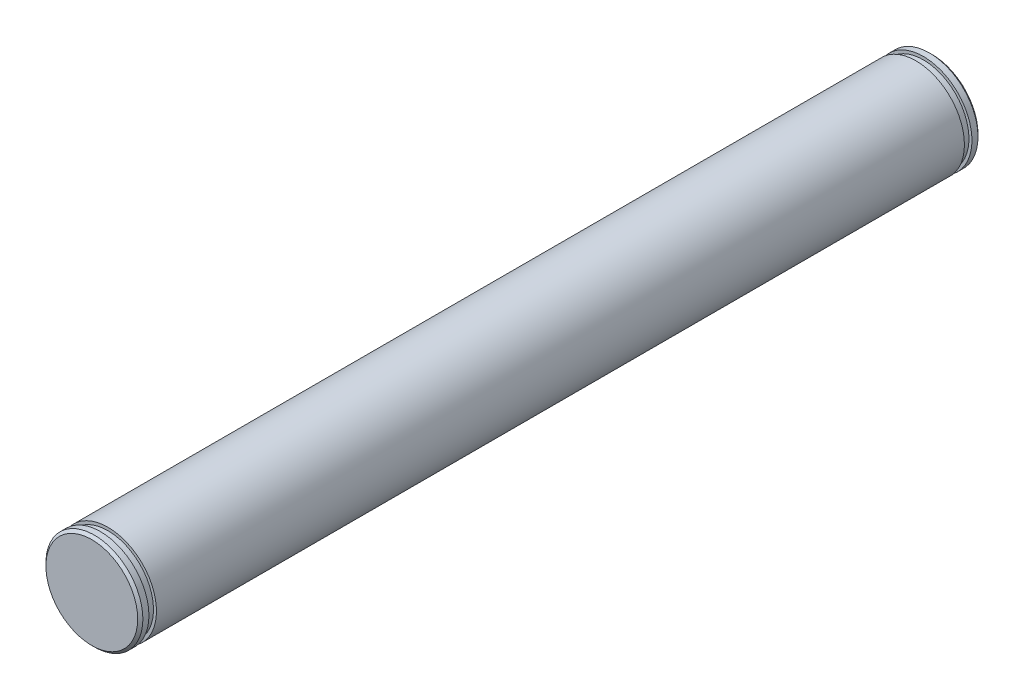
ISO-10303-21;
HEADER;
FILE_DESCRIPTION(('STEP AP214'),'2;1');
FILE_NAME('part.step','',(''),(''),'','','');
FILE_SCHEMA(('AUTOMOTIVE_DESIGN { 1 0 10303 214 1 1 1 1 }'));
ENDSEC;
DATA;
#1=APPLICATION_CONTEXT('core data for automotive mechanical design processes');
#2=APPLICATION_PROTOCOL_DEFINITION('international standard','automotive_design',2000,#1);
#3=PRODUCT_CONTEXT('',#1,'mechanical');
#4=PRODUCT('Part','Part','',(#3));
#5=PRODUCT_RELATED_PRODUCT_CATEGORY('part','',(#4));
#6=PRODUCT_DEFINITION_FORMATION('','',#4);
#7=PRODUCT_DEFINITION_CONTEXT('part definition',#1,'design');
#8=PRODUCT_DEFINITION('design','',#6,#7);
#9=PRODUCT_DEFINITION_SHAPE('','',#8);
#10=(LENGTH_UNIT() NAMED_UNIT(*) SI_UNIT(.MILLI.,.METRE.));
#11=(NAMED_UNIT(*) PLANE_ANGLE_UNIT() SI_UNIT($,.RADIAN.));
#12=(NAMED_UNIT(*) SI_UNIT($,.STERADIAN.) SOLID_ANGLE_UNIT());
#13=UNCERTAINTY_MEASURE_WITH_UNIT(LENGTH_MEASURE(1.E-05),#10,'distance_accuracy_value','');
#14=(GEOMETRIC_REPRESENTATION_CONTEXT(3) GLOBAL_UNCERTAINTY_ASSIGNED_CONTEXT((#13)) GLOBAL_UNIT_ASSIGNED_CONTEXT((#10,
#11,#12)) REPRESENTATION_CONTEXT('',''));
#15=CARTESIAN_POINT('',(0.,0.,0.));
#16=DIRECTION('',(0.,0.,1.));
#17=DIRECTION('',(1.,0.,0.));
#18=AXIS2_PLACEMENT_3D('',#15,#16,#17);
#19=CARTESIAN_POINT('',(0.,0.,41.275));
#20=DIRECTION('',(0.,0.,-1.));
#21=DIRECTION('',(-1.,0.,0.));
#22=AXIS2_PLACEMENT_3D('',#19,#20,#21);
#23=CYLINDRICAL_SURFACE('',#22,4.7625);
#24=CARTESIAN_POINT('',(0.,0.,41.021));
#25=DIRECTION('',(0.,0.,1.));
#26=DIRECTION('',(1.,0.,0.));
#27=AXIS2_PLACEMENT_3D('',#24,#25,#26);
#28=CIRCLE('',#27,4.7625);
#29=CARTESIAN_POINT('',(4.7625,0.,41.021));
#30=VERTEX_POINT('',#29);
#31=EDGE_CURVE('E10',#30,#30,#28,.F.);
#32=ORIENTED_EDGE('',*,*,#31,.T.);
#33=EDGE_LOOP('',(#32));
#34=FACE_BOUND('',#33,.T.);
#35=CARTESIAN_POINT('',(0.,0.,40.4241));
#36=DIRECTION('',(0.,0.,1.));
#37=DIRECTION('',(1.,0.,0.));
#38=AXIS2_PLACEMENT_3D('',#35,#36,#37);
#39=CIRCLE('',#38,4.7625);
#40=CARTESIAN_POINT('',(4.7625,0.,40.4241));
#41=VERTEX_POINT('',#40);
#42=EDGE_CURVE('E73',#41,#41,#39,.T.);
#43=ORIENTED_EDGE('',*,*,#42,.T.);
#44=EDGE_LOOP('',(#43));
#45=FACE_BOUND('',#44,.T.);
#46=ADVANCED_FACE('F34',(#34,#45),#23,.T.);
#47=CARTESIAN_POINT('',(0.,0.,41.275));
#48=DIRECTION('',(0.,0.,1.));
#49=DIRECTION('',(1.,0.,0.));
#50=AXIS2_PLACEMENT_3D('',#47,#48,#49);
#51=PLANE('',#50);
#52=CARTESIAN_POINT('',(0.,0.,41.275));
#53=DIRECTION('',(0.,0.,1.));
#54=DIRECTION('',(1.,0.,0.));
#55=AXIS2_PLACEMENT_3D('',#52,#53,#54);
#56=CIRCLE('',#55,4.50850000000002);
#57=CARTESIAN_POINT('',(4.50850000000002,0.,41.275));
#58=VERTEX_POINT('',#57);
#59=EDGE_CURVE('E42',#58,#58,#56,.T.);
#60=ORIENTED_EDGE('',*,*,#59,.T.);
#61=EDGE_LOOP('',(#60));
#62=FACE_BOUND('',#61,.T.);
#63=ADVANCED_FACE('F97',(#62),#51,.T.);
#64=CARTESIAN_POINT('',(0.,7.01039999999999,40.4241));
#65=DIRECTION('',(0.,0.,1.));
#66=DIRECTION('',(1.,0.,0.));
#67=AXIS2_PLACEMENT_3D('',#64,#65,#66);
#68=PLANE('',#67);
#69=CARTESIAN_POINT('',(0.,0.,40.4241));
#70=DIRECTION('',(0.,0.,-1.));
#71=DIRECTION('',(-1.,0.,0.));
#72=AXIS2_PLACEMENT_3D('',#69,#70,#71);
#73=CIRCLE('',#72,4.47039999999999);
#74=CARTESIAN_POINT('',(-4.47039999999999,0.,40.4241));
#75=VERTEX_POINT('',#74);
#76=EDGE_CURVE('E67',#75,#75,#73,.T.);
#77=ORIENTED_EDGE('',*,*,#76,.F.);
#78=EDGE_LOOP('',(#77));
#79=FACE_BOUND('',#78,.T.);
#80=ORIENTED_EDGE('',*,*,#42,.F.);
#81=EDGE_LOOP('',(#80));
#82=FACE_BOUND('',#81,.T.);
#83=ADVANCED_FACE('F113',(#79,#82),#68,.F.);
#84=CARTESIAN_POINT('',(0.,7.01039999999999,39.6875));
#85=DIRECTION('',(0.,0.,-1.));
#86=DIRECTION('',(-1.,0.,0.));
#87=AXIS2_PLACEMENT_3D('',#84,#85,#86);
#88=PLANE('',#87);
#89=CARTESIAN_POINT('',(0.,0.,39.6875));
#90=DIRECTION('',(0.,0.,-1.));
#91=DIRECTION('',(-1.,0.,0.));
#92=AXIS2_PLACEMENT_3D('',#89,#90,#91);
#93=CIRCLE('',#92,4.47039999999999);
#94=CARTESIAN_POINT('',(-4.47039999999999,0.,39.6875));
#95=VERTEX_POINT('',#94);
#96=EDGE_CURVE('E56',#95,#95,#93,.T.);
#97=ORIENTED_EDGE('',*,*,#96,.T.);
#98=EDGE_LOOP('',(#97));
#99=FACE_BOUND('',#98,.T.);
#100=CARTESIAN_POINT('',(0.,0.,39.6875));
#101=DIRECTION('',(0.,0.,-1.));
#102=DIRECTION('',(-1.,0.,0.));
#103=AXIS2_PLACEMENT_3D('',#100,#101,#102);
#104=CIRCLE('',#103,4.7625);
#105=CARTESIAN_POINT('',(-4.7625,0.,39.6875));
#106=VERTEX_POINT('',#105);
#107=EDGE_CURVE('E70',#106,#106,#104,.T.);
#108=ORIENTED_EDGE('',*,*,#107,.F.);
#109=EDGE_LOOP('',(#108));
#110=FACE_BOUND('',#109,.T.);
#111=ADVANCED_FACE('F106',(#99,#110),#88,.F.);
#112=CARTESIAN_POINT('',(0.,0.,0.));
#113=DIRECTION('',(0.,0.,-1.));
#114=DIRECTION('',(-1.,0.,0.));
#115=AXIS2_PLACEMENT_3D('',#112,#113,#114);
#116=CYLINDRICAL_SURFACE('',#115,4.47039999999999);
#117=ORIENTED_EDGE('',*,*,#96,.F.);
#118=EDGE_LOOP('',(#117));
#119=FACE_BOUND('',#118,.T.);
#120=ORIENTED_EDGE('',*,*,#76,.T.);
#121=EDGE_LOOP('',(#120));
#122=FACE_BOUND('',#121,.T.);
#123=ADVANCED_FACE('F99',(#119,#122),#116,.T.);
#124=CARTESIAN_POINT('',(0.,0.,-39.6875));
#125=DIRECTION('',(0.,0.,1.));
#126=DIRECTION('',(1.,0.,0.));
#127=AXIS2_PLACEMENT_3D('',#124,#125,#126);
#128=CIRCLE('',#127,4.7625);
#129=CARTESIAN_POINT('',(4.7625,0.,-39.6875));
#130=VERTEX_POINT('',#129);
#131=EDGE_CURVE('E50',#130,#130,#128,.T.);
#132=ORIENTED_EDGE('',*,*,#131,.T.);
#133=EDGE_LOOP('',(#132));
#134=FACE_BOUND('',#133,.T.);
#135=ORIENTED_EDGE('',*,*,#107,.T.);
#136=EDGE_LOOP('',(#135));
#137=FACE_BOUND('',#136,.T.);
#138=ADVANCED_FACE('F92',(#134,#137),#23,.T.);
#139=CARTESIAN_POINT('',(0.,0.,41.275));
#140=DIRECTION('',(0.,0.,-1.));
#141=DIRECTION('',(-1.,0.,0.));
#142=AXIS2_PLACEMENT_3D('',#139,#140,#141);
#143=CONICAL_SURFACE('',#142,4.50850000000002,0.785398163397455);
#144=ORIENTED_EDGE('',*,*,#31,.F.);
#145=EDGE_LOOP('',(#144));
#146=FACE_BOUND('',#145,.T.);
#147=ORIENTED_EDGE('',*,*,#59,.F.);
#148=EDGE_LOOP('',(#147));
#149=FACE_BOUND('',#148,.T.);
#150=ADVANCED_FACE('F36',(#146,#149),#143,.T.);
#151=CARTESIAN_POINT('',(0.,7.01039999999999,-40.4241));
#152=DIRECTION('',(0.,0.,-1.));
#153=DIRECTION('',(1.,0.,0.));
#154=AXIS2_PLACEMENT_3D('',#151,#152,#153);
#155=PLANE('',#154);
#156=CARTESIAN_POINT('',(0.,0.,-40.4241));
#157=DIRECTION('',(0.,0.,-1.));
#158=DIRECTION('',(-1.,0.,0.));
#159=AXIS2_PLACEMENT_3D('',#156,#157,#158);
#160=CIRCLE('',#159,4.47039999999999);
#161=CARTESIAN_POINT('',(-4.47039999999999,0.,-40.4241));
#162=VERTEX_POINT('',#161);
#163=EDGE_CURVE('E52',#162,#162,#160,.T.);
#164=ORIENTED_EDGE('',*,*,#163,.T.);
#165=EDGE_LOOP('',(#164));
#166=FACE_BOUND('',#165,.T.);
#167=CARTESIAN_POINT('',(0.,0.,-40.4241));
#168=DIRECTION('',(0.,0.,-1.));
#169=DIRECTION('',(-1.,0.,0.));
#170=AXIS2_PLACEMENT_3D('',#167,#168,#169);
#171=CIRCLE('',#170,4.7625);
#172=CARTESIAN_POINT('',(-4.7625,0.,-40.4241));
#173=VERTEX_POINT('',#172);
#174=EDGE_CURVE('E38',#173,#173,#171,.T.);
#175=ORIENTED_EDGE('',*,*,#174,.F.);
#176=EDGE_LOOP('',(#175));
#177=FACE_BOUND('',#176,.T.);
#178=ADVANCED_FACE('F104',(#166,#177),#155,.F.);
#179=CARTESIAN_POINT('',(0.,7.01039999999999,-39.6875));
#180=DIRECTION('',(0.,0.,1.));
#181=DIRECTION('',(-1.,0.,0.));
#182=AXIS2_PLACEMENT_3D('',#179,#180,#181);
#183=PLANE('',#182);
#184=CARTESIAN_POINT('',(0.,0.,-39.6875));
#185=DIRECTION('',(0.,0.,-1.));
#186=DIRECTION('',(-1.,0.,0.));
#187=AXIS2_PLACEMENT_3D('',#184,#185,#186);
#188=CIRCLE('',#187,4.47039999999999);
#189=CARTESIAN_POINT('',(-4.47039999999999,0.,-39.6875));
#190=VERTEX_POINT('',#189);
#191=EDGE_CURVE('E58',#190,#190,#188,.T.);
#192=ORIENTED_EDGE('',*,*,#191,.F.);
#193=EDGE_LOOP('',(#192));
#194=FACE_BOUND('',#193,.T.);
#195=ORIENTED_EDGE('',*,*,#131,.F.);
#196=EDGE_LOOP('',(#195));
#197=FACE_BOUND('',#196,.T.);
#198=ADVANCED_FACE('F131',(#194,#197),#183,.F.);
#199=CARTESIAN_POINT('',(0.,0.,0.));
#200=DIRECTION('',(0.,0.,1.));
#201=DIRECTION('',(-1.,0.,0.));
#202=AXIS2_PLACEMENT_3D('',#199,#200,#201);
#203=CYLINDRICAL_SURFACE('',#202,4.47039999999999);
#204=ORIENTED_EDGE('',*,*,#191,.T.);
#205=EDGE_LOOP('',(#204));
#206=FACE_BOUND('',#205,.T.);
#207=ORIENTED_EDGE('',*,*,#163,.F.);
#208=EDGE_LOOP('',(#207));
#209=FACE_BOUND('',#208,.T.);
#210=ADVANCED_FACE('F127',(#206,#209),#203,.T.);
#211=CARTESIAN_POINT('',(0.,0.,-41.275));
#212=DIRECTION('',(0.,0.,1.));
#213=DIRECTION('',(1.,0.,0.));
#214=AXIS2_PLACEMENT_3D('',#211,#212,#213);
#215=PLANE('',#214);
#216=CARTESIAN_POINT('',(0.,0.,-41.275));
#217=DIRECTION('',(0.,0.,1.));
#218=DIRECTION('',(1.,0.,0.));
#219=AXIS2_PLACEMENT_3D('',#216,#217,#218);
#220=CIRCLE('',#219,4.50849999999999);
#221=CARTESIAN_POINT('',(4.50849999999999,0.,-41.275));
#222=VERTEX_POINT('',#221);
#223=EDGE_CURVE('E47',#222,#222,#220,.F.);
#224=ORIENTED_EDGE('',*,*,#223,.T.);
#225=EDGE_LOOP('',(#224));
#226=FACE_BOUND('',#225,.T.);
#227=ADVANCED_FACE('F81',(#226),#215,.F.);
#228=CARTESIAN_POINT('',(0.,0.,-41.021));
#229=DIRECTION('',(0.,0.,1.));
#230=DIRECTION('',(1.,0.,0.));
#231=AXIS2_PLACEMENT_3D('',#228,#229,#230);
#232=CONICAL_SURFACE('',#231,4.7625,0.785398163397428);
#233=ORIENTED_EDGE('',*,*,#223,.F.);
#234=EDGE_LOOP('',(#233));
#235=FACE_BOUND('',#234,.T.);
#236=CARTESIAN_POINT('',(0.,0.,-41.021));
#237=DIRECTION('',(0.,0.,1.));
#238=DIRECTION('',(1.,0.,0.));
#239=AXIS2_PLACEMENT_3D('',#236,#237,#238);
#240=CIRCLE('',#239,4.7625);
#241=CARTESIAN_POINT('',(4.7625,0.,-41.021));
#242=VERTEX_POINT('',#241);
#243=EDGE_CURVE('E76',#242,#242,#240,.T.);
#244=ORIENTED_EDGE('',*,*,#243,.F.);
#245=EDGE_LOOP('',(#244));
#246=FACE_BOUND('',#245,.T.);
#247=ADVANCED_FACE('F83',(#235,#246),#232,.T.);
#248=ORIENTED_EDGE('',*,*,#174,.T.);
#249=EDGE_LOOP('',(#248));
#250=FACE_BOUND('',#249,.T.);
#251=ORIENTED_EDGE('',*,*,#243,.T.);
#252=EDGE_LOOP('',(#251));
#253=FACE_BOUND('',#252,.T.);
#254=ADVANCED_FACE('F86',(#250,#253),#23,.T.);
#255=CLOSED_SHELL('',(#46,#63,#83,#111,#123,#138,#150,#178,#198,#210,#227,#247,#254));
#256=MANIFOLD_SOLID_BREP('B2',#255);
#257=ADVANCED_BREP_SHAPE_REPRESENTATION('',(#18,#256),#14);
#258=SHAPE_DEFINITION_REPRESENTATION(#9,#257);
ENDSEC;
END-ISO-10303-21;
